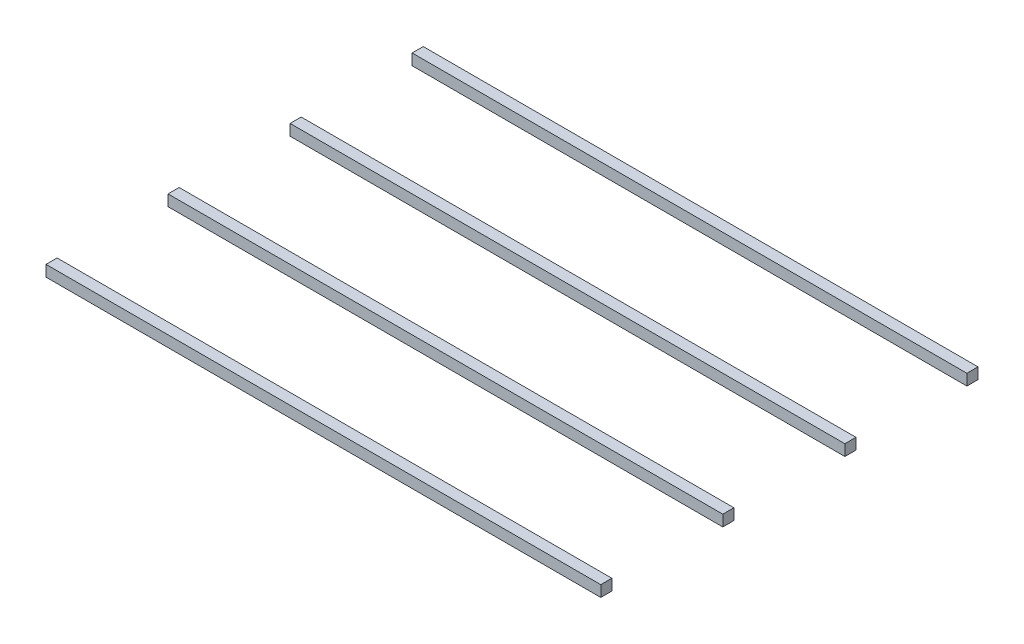
ISO-10303-21;
HEADER;
FILE_DESCRIPTION(('STEP AP214'),'2;1');
FILE_NAME('part.step','',(''),(''),'','','');
FILE_SCHEMA(('AUTOMOTIVE_DESIGN { 1 0 10303 214 1 1 1 1 }'));
ENDSEC;
DATA;
#1=APPLICATION_CONTEXT('core data for automotive mechanical design processes');
#2=APPLICATION_PROTOCOL_DEFINITION('international standard','automotive_design',2000,#1);
#3=PRODUCT_CONTEXT('',#1,'mechanical');
#4=PRODUCT('Part','Part','',(#3));
#5=PRODUCT_RELATED_PRODUCT_CATEGORY('part','',(#4));
#6=PRODUCT_DEFINITION_FORMATION('','',#4);
#7=PRODUCT_DEFINITION_CONTEXT('part definition',#1,'design');
#8=PRODUCT_DEFINITION('design','',#6,#7);
#9=PRODUCT_DEFINITION_SHAPE('','',#8);
#10=(LENGTH_UNIT() NAMED_UNIT(*) SI_UNIT(.MILLI.,.METRE.));
#11=(NAMED_UNIT(*) PLANE_ANGLE_UNIT() SI_UNIT($,.RADIAN.));
#12=(NAMED_UNIT(*) SI_UNIT($,.STERADIAN.) SOLID_ANGLE_UNIT());
#13=UNCERTAINTY_MEASURE_WITH_UNIT(LENGTH_MEASURE(1.E-05),#10,'distance_accuracy_value','');
#14=(GEOMETRIC_REPRESENTATION_CONTEXT(3) GLOBAL_UNCERTAINTY_ASSIGNED_CONTEXT((#13)) GLOBAL_UNIT_ASSIGNED_CONTEXT((#10,
#11,#12)) REPRESENTATION_CONTEXT('',''));
#15=CARTESIAN_POINT('',(0.,0.,0.));
#16=DIRECTION('',(0.,0.,1.));
#17=DIRECTION('',(1.,0.,0.));
#18=AXIS2_PLACEMENT_3D('',#15,#16,#17);
#19=CARTESIAN_POINT('',(-24.5316681534344,1.,26.5222632436078));
#20=DIRECTION('',(1.,0.,0.));
#21=DIRECTION('',(0.,0.,-1.));
#22=AXIS2_PLACEMENT_3D('',#19,#20,#21);
#23=PLANE('',#22);
#24=DIRECTION('',(0.,0.,1.));
#25=VECTOR('',#24,1.);
#26=CARTESIAN_POINT('',(-24.5316681534344,0.,26.5222632436078));
#27=LINE('',#26,#25);
#28=CARTESIAN_POINT('',(-24.5316681534344,0.,26.5222632436078));
#29=VERTEX_POINT('',#28);
#30=CARTESIAN_POINT('',(-24.5316681534344,0.,27.5222632436078));
#31=VERTEX_POINT('',#30);
#32=EDGE_CURVE('E107',#29,#31,#27,.T.);
#33=ORIENTED_EDGE('',*,*,#32,.T.);
#34=DIRECTION('',(0.,-1.,0.));
#35=VECTOR('',#34,1.);
#36=CARTESIAN_POINT('',(-24.5316681534344,1.,27.5222632436078));
#37=LINE('',#36,#35);
#38=CARTESIAN_POINT('',(-24.5316681534344,1.,27.5222632436078));
#39=VERTEX_POINT('',#38);
#40=EDGE_CURVE('E12',#39,#31,#37,.T.);
#41=ORIENTED_EDGE('',*,*,#40,.F.);
#42=DIRECTION('',(0.,0.,1.));
#43=VECTOR('',#42,1.);
#44=CARTESIAN_POINT('',(-24.5316681534344,1.,26.5222632436078));
#45=LINE('',#44,#43);
#46=CARTESIAN_POINT('',(-24.5316681534344,1.,26.5222632436078));
#47=VERTEX_POINT('',#46);
#48=EDGE_CURVE('E95',#47,#39,#45,.T.);
#49=ORIENTED_EDGE('',*,*,#48,.F.);
#50=DIRECTION('',(0.,-1.,0.));
#51=VECTOR('',#50,1.);
#52=CARTESIAN_POINT('',(-24.5316681534344,1.,26.5222632436078));
#53=LINE('',#52,#51);
#54=EDGE_CURVE('E103',#47,#29,#53,.T.);
#55=ORIENTED_EDGE('',*,*,#54,.T.);
#56=EDGE_LOOP('',(#33,#41,#49,#55));
#57=FACE_BOUND('',#56,.T.);
#58=ADVANCED_FACE('F44',(#57),#23,.F.);
#59=CARTESIAN_POINT('',(-24.5316681534344,1.,27.5222632436078));
#60=DIRECTION('',(0.,0.,-1.));
#61=DIRECTION('',(-1.,0.,0.));
#62=AXIS2_PLACEMENT_3D('',#59,#60,#61);
#63=PLANE('',#62);
#64=DIRECTION('',(1.,0.,0.));
#65=VECTOR('',#64,1.);
#66=CARTESIAN_POINT('',(-24.5316681534344,0.,27.5222632436078));
#67=LINE('',#66,#65);
#68=CARTESIAN_POINT('',(25.4683318465656,0.,27.5222632436078));
#69=VERTEX_POINT('',#68);
#70=EDGE_CURVE('E99',#31,#69,#67,.T.);
#71=ORIENTED_EDGE('',*,*,#70,.T.);
#72=DIRECTION('',(0.,-1.,0.));
#73=VECTOR('',#72,1.);
#74=CARTESIAN_POINT('',(25.4683318465656,1.,27.5222632436078));
#75=LINE('',#74,#73);
#76=CARTESIAN_POINT('',(25.4683318465656,1.,27.5222632436078));
#77=VERTEX_POINT('',#76);
#78=EDGE_CURVE('E52',#77,#69,#75,.T.);
#79=ORIENTED_EDGE('',*,*,#78,.F.);
#80=DIRECTION('',(1.,0.,0.));
#81=VECTOR('',#80,1.);
#82=CARTESIAN_POINT('',(-24.5316681534344,1.,27.5222632436078));
#83=LINE('',#82,#81);
#84=EDGE_CURVE('E90',#39,#77,#83,.T.);
#85=ORIENTED_EDGE('',*,*,#84,.F.);
#86=ORIENTED_EDGE('',*,*,#40,.T.);
#87=EDGE_LOOP('',(#71,#79,#85,#86));
#88=FACE_BOUND('',#87,.T.);
#89=ADVANCED_FACE('F98',(#88),#63,.F.);
#90=CARTESIAN_POINT('',(25.4683318465656,1.,26.5222632436078));
#91=DIRECTION('',(-1.,0.,0.));
#92=DIRECTION('',(0.,0.,1.));
#93=AXIS2_PLACEMENT_3D('',#90,#91,#92);
#94=PLANE('',#93);
#95=DIRECTION('',(0.,0.,-1.));
#96=VECTOR('',#95,1.);
#97=CARTESIAN_POINT('',(25.4683318465656,0.,26.5222632436078));
#98=LINE('',#97,#96);
#99=CARTESIAN_POINT('',(25.4683318465656,0.,26.5222632436078));
#100=VERTEX_POINT('',#99);
#101=EDGE_CURVE('E77',#69,#100,#98,.T.);
#102=ORIENTED_EDGE('',*,*,#101,.T.);
#103=DIRECTION('',(0.,-1.,0.));
#104=VECTOR('',#103,1.);
#105=CARTESIAN_POINT('',(25.4683318465656,1.,26.5222632436078));
#106=LINE('',#105,#104);
#107=CARTESIAN_POINT('',(25.4683318465656,1.,26.5222632436078));
#108=VERTEX_POINT('',#107);
#109=EDGE_CURVE('E100',#108,#100,#106,.T.);
#110=ORIENTED_EDGE('',*,*,#109,.F.);
#111=DIRECTION('',(0.,0.,-1.));
#112=VECTOR('',#111,1.);
#113=CARTESIAN_POINT('',(25.4683318465656,1.,26.5222632436078));
#114=LINE('',#113,#112);
#115=EDGE_CURVE('E93',#77,#108,#114,.T.);
#116=ORIENTED_EDGE('',*,*,#115,.F.);
#117=ORIENTED_EDGE('',*,*,#78,.T.);
#118=EDGE_LOOP('',(#102,#110,#116,#117));
#119=FACE_BOUND('',#118,.T.);
#120=ADVANCED_FACE('F101',(#119),#94,.F.);
#121=CARTESIAN_POINT('',(-24.5316681534344,1.,26.5222632436078));
#122=DIRECTION('',(0.,0.,1.));
#123=DIRECTION('',(1.,0.,0.));
#124=AXIS2_PLACEMENT_3D('',#121,#122,#123);
#125=PLANE('',#124);
#126=DIRECTION('',(-1.,0.,0.));
#127=VECTOR('',#126,1.);
#128=CARTESIAN_POINT('',(-24.5316681534344,0.,26.5222632436078));
#129=LINE('',#128,#127);
#130=EDGE_CURVE('E83',#100,#29,#129,.T.);
#131=ORIENTED_EDGE('',*,*,#130,.T.);
#132=ORIENTED_EDGE('',*,*,#54,.F.);
#133=DIRECTION('',(-1.,0.,0.));
#134=VECTOR('',#133,1.);
#135=CARTESIAN_POINT('',(-24.5316681534344,1.,26.5222632436078));
#136=LINE('',#135,#134);
#137=EDGE_CURVE('E60',#108,#47,#136,.T.);
#138=ORIENTED_EDGE('',*,*,#137,.F.);
#139=ORIENTED_EDGE('',*,*,#109,.T.);
#140=EDGE_LOOP('',(#131,#132,#138,#139));
#141=FACE_BOUND('',#140,.T.);
#142=ADVANCED_FACE('F114',(#141),#125,.F.);
#143=CARTESIAN_POINT('',(0.,1.,0.));
#144=DIRECTION('',(0.,1.,0.));
#145=DIRECTION('',(0.,0.,1.));
#146=AXIS2_PLACEMENT_3D('',#143,#144,#145);
#147=PLANE('',#146);
#148=ORIENTED_EDGE('',*,*,#48,.T.);
#149=ORIENTED_EDGE('',*,*,#84,.T.);
#150=ORIENTED_EDGE('',*,*,#115,.T.);
#151=ORIENTED_EDGE('',*,*,#137,.T.);
#152=EDGE_LOOP('',(#148,#149,#150,#151));
#153=FACE_BOUND('',#152,.T.);
#154=ADVANCED_FACE('F91',(#153),#147,.T.);
#155=CARTESIAN_POINT('',(0.,0.,0.));
#156=DIRECTION('',(0.,1.,0.));
#157=DIRECTION('',(0.,0.,1.));
#158=AXIS2_PLACEMENT_3D('',#155,#156,#157);
#159=PLANE('',#158);
#160=ORIENTED_EDGE('',*,*,#32,.F.);
#161=ORIENTED_EDGE('',*,*,#130,.F.);
#162=ORIENTED_EDGE('',*,*,#101,.F.);
#163=ORIENTED_EDGE('',*,*,#70,.F.);
#164=EDGE_LOOP('',(#160,#161,#162,#163));
#165=FACE_BOUND('',#164,.T.);
#166=ADVANCED_FACE('F117',(#165),#159,.F.);
#167=CLOSED_SHELL('',(#58,#89,#120,#142,#154,#166));
#168=MANIFOLD_SOLID_BREP('B2',#167);
#169=CARTESIAN_POINT('',(-24.5316681534344,1.,15.5222632436078));
#170=DIRECTION('',(1.,0.,0.));
#171=DIRECTION('',(0.,0.,-1.));
#172=AXIS2_PLACEMENT_3D('',#169,#170,#171);
#173=PLANE('',#172);
#174=DIRECTION('',(0.,0.,1.));
#175=VECTOR('',#174,1.);
#176=CARTESIAN_POINT('',(-24.5316681534344,0.,15.5222632436078));
#177=LINE('',#176,#175);
#178=CARTESIAN_POINT('',(-24.5316681534344,0.,15.5222632436078));
#179=VERTEX_POINT('',#178);
#180=CARTESIAN_POINT('',(-24.5316681534344,0.,16.5222632436078));
#181=VERTEX_POINT('',#180);
#182=EDGE_CURVE('E241',#179,#181,#177,.T.);
#183=ORIENTED_EDGE('',*,*,#182,.T.);
#184=DIRECTION('',(0.,-1.,0.));
#185=VECTOR('',#184,1.);
#186=CARTESIAN_POINT('',(-24.5316681534344,1.,16.5222632436078));
#187=LINE('',#186,#185);
#188=CARTESIAN_POINT('',(-24.5316681534344,1.,16.5222632436078));
#189=VERTEX_POINT('',#188);
#190=EDGE_CURVE('E42',#189,#181,#187,.T.);
#191=ORIENTED_EDGE('',*,*,#190,.F.);
#192=DIRECTION('',(0.,0.,1.));
#193=VECTOR('',#192,1.);
#194=CARTESIAN_POINT('',(-24.5316681534344,1.,15.5222632436078));
#195=LINE('',#194,#193);
#196=CARTESIAN_POINT('',(-24.5316681534344,1.,15.5222632436078));
#197=VERTEX_POINT('',#196);
#198=EDGE_CURVE('E229',#197,#189,#195,.T.);
#199=ORIENTED_EDGE('',*,*,#198,.F.);
#200=DIRECTION('',(0.,-1.,0.));
#201=VECTOR('',#200,1.);
#202=CARTESIAN_POINT('',(-24.5316681534344,1.,15.5222632436078));
#203=LINE('',#202,#201);
#204=EDGE_CURVE('E237',#197,#179,#203,.T.);
#205=ORIENTED_EDGE('',*,*,#204,.T.);
#206=EDGE_LOOP('',(#183,#191,#199,#205));
#207=FACE_BOUND('',#206,.T.);
#208=ADVANCED_FACE('F178',(#207),#173,.F.);
#209=CARTESIAN_POINT('',(-24.5316681534344,1.,16.5222632436078));
#210=DIRECTION('',(0.,0.,-1.));
#211=DIRECTION('',(-1.,0.,0.));
#212=AXIS2_PLACEMENT_3D('',#209,#210,#211);
#213=PLANE('',#212);
#214=DIRECTION('',(1.,0.,0.));
#215=VECTOR('',#214,1.);
#216=CARTESIAN_POINT('',(-24.5316681534344,0.,16.5222632436078));
#217=LINE('',#216,#215);
#218=CARTESIAN_POINT('',(25.4683318465656,0.,16.5222632436078));
#219=VERTEX_POINT('',#218);
#220=EDGE_CURVE('E233',#181,#219,#217,.T.);
#221=ORIENTED_EDGE('',*,*,#220,.T.);
#222=DIRECTION('',(0.,-1.,0.));
#223=VECTOR('',#222,1.);
#224=CARTESIAN_POINT('',(25.4683318465656,1.,16.5222632436078));
#225=LINE('',#224,#223);
#226=CARTESIAN_POINT('',(25.4683318465656,1.,16.5222632436078));
#227=VERTEX_POINT('',#226);
#228=EDGE_CURVE('E186',#227,#219,#225,.T.);
#229=ORIENTED_EDGE('',*,*,#228,.F.);
#230=DIRECTION('',(1.,0.,0.));
#231=VECTOR('',#230,1.);
#232=CARTESIAN_POINT('',(-24.5316681534344,1.,16.5222632436078));
#233=LINE('',#232,#231);
#234=EDGE_CURVE('E224',#189,#227,#233,.T.);
#235=ORIENTED_EDGE('',*,*,#234,.F.);
#236=ORIENTED_EDGE('',*,*,#190,.T.);
#237=EDGE_LOOP('',(#221,#229,#235,#236));
#238=FACE_BOUND('',#237,.T.);
#239=ADVANCED_FACE('F232',(#238),#213,.F.);
#240=CARTESIAN_POINT('',(25.4683318465656,1.,15.5222632436078));
#241=DIRECTION('',(-1.,0.,0.));
#242=DIRECTION('',(0.,0.,1.));
#243=AXIS2_PLACEMENT_3D('',#240,#241,#242);
#244=PLANE('',#243);
#245=DIRECTION('',(0.,0.,-1.));
#246=VECTOR('',#245,1.);
#247=CARTESIAN_POINT('',(25.4683318465656,0.,15.5222632436078));
#248=LINE('',#247,#246);
#249=CARTESIAN_POINT('',(25.4683318465656,0.,15.5222632436078));
#250=VERTEX_POINT('',#249);
#251=EDGE_CURVE('E211',#219,#250,#248,.T.);
#252=ORIENTED_EDGE('',*,*,#251,.T.);
#253=DIRECTION('',(0.,-1.,0.));
#254=VECTOR('',#253,1.);
#255=CARTESIAN_POINT('',(25.4683318465656,1.,15.5222632436078));
#256=LINE('',#255,#254);
#257=CARTESIAN_POINT('',(25.4683318465656,1.,15.5222632436078));
#258=VERTEX_POINT('',#257);
#259=EDGE_CURVE('E234',#258,#250,#256,.T.);
#260=ORIENTED_EDGE('',*,*,#259,.F.);
#261=DIRECTION('',(0.,0.,-1.));
#262=VECTOR('',#261,1.);
#263=CARTESIAN_POINT('',(25.4683318465656,1.,15.5222632436078));
#264=LINE('',#263,#262);
#265=EDGE_CURVE('E227',#227,#258,#264,.T.);
#266=ORIENTED_EDGE('',*,*,#265,.F.);
#267=ORIENTED_EDGE('',*,*,#228,.T.);
#268=EDGE_LOOP('',(#252,#260,#266,#267));
#269=FACE_BOUND('',#268,.T.);
#270=ADVANCED_FACE('F235',(#269),#244,.F.);
#271=CARTESIAN_POINT('',(-24.5316681534344,1.,15.5222632436078));
#272=DIRECTION('',(0.,0.,1.));
#273=DIRECTION('',(1.,0.,0.));
#274=AXIS2_PLACEMENT_3D('',#271,#272,#273);
#275=PLANE('',#274);
#276=DIRECTION('',(-1.,0.,0.));
#277=VECTOR('',#276,1.);
#278=CARTESIAN_POINT('',(-24.5316681534344,0.,15.5222632436078));
#279=LINE('',#278,#277);
#280=EDGE_CURVE('E217',#250,#179,#279,.T.);
#281=ORIENTED_EDGE('',*,*,#280,.T.);
#282=ORIENTED_EDGE('',*,*,#204,.F.);
#283=DIRECTION('',(-1.,0.,0.));
#284=VECTOR('',#283,1.);
#285=CARTESIAN_POINT('',(-24.5316681534344,1.,15.5222632436078));
#286=LINE('',#285,#284);
#287=EDGE_CURVE('E194',#258,#197,#286,.T.);
#288=ORIENTED_EDGE('',*,*,#287,.F.);
#289=ORIENTED_EDGE('',*,*,#259,.T.);
#290=EDGE_LOOP('',(#281,#282,#288,#289));
#291=FACE_BOUND('',#290,.T.);
#292=ADVANCED_FACE('F248',(#291),#275,.F.);
#293=CARTESIAN_POINT('',(0.,1.,0.));
#294=DIRECTION('',(0.,1.,0.));
#295=DIRECTION('',(0.,0.,1.));
#296=AXIS2_PLACEMENT_3D('',#293,#294,#295);
#297=PLANE('',#296);
#298=ORIENTED_EDGE('',*,*,#198,.T.);
#299=ORIENTED_EDGE('',*,*,#234,.T.);
#300=ORIENTED_EDGE('',*,*,#265,.T.);
#301=ORIENTED_EDGE('',*,*,#287,.T.);
#302=EDGE_LOOP('',(#298,#299,#300,#301));
#303=FACE_BOUND('',#302,.T.);
#304=ADVANCED_FACE('F225',(#303),#297,.T.);
#305=CARTESIAN_POINT('',(0.,0.,0.));
#306=DIRECTION('',(0.,1.,0.));
#307=DIRECTION('',(0.,0.,1.));
#308=AXIS2_PLACEMENT_3D('',#305,#306,#307);
#309=PLANE('',#308);
#310=ORIENTED_EDGE('',*,*,#182,.F.);
#311=ORIENTED_EDGE('',*,*,#280,.F.);
#312=ORIENTED_EDGE('',*,*,#251,.F.);
#313=ORIENTED_EDGE('',*,*,#220,.F.);
#314=EDGE_LOOP('',(#310,#311,#312,#313));
#315=FACE_BOUND('',#314,.T.);
#316=ADVANCED_FACE('F251',(#315),#309,.F.);
#317=CLOSED_SHELL('',(#208,#239,#270,#292,#304,#316));
#318=MANIFOLD_SOLID_BREP('B6',#317);
#319=CARTESIAN_POINT('',(-24.5316681534344,1.,4.52226324360778));
#320=DIRECTION('',(1.,0.,0.));
#321=DIRECTION('',(0.,0.,-1.));
#322=AXIS2_PLACEMENT_3D('',#319,#320,#321);
#323=PLANE('',#322);
#324=DIRECTION('',(0.,0.,1.));
#325=VECTOR('',#324,1.);
#326=CARTESIAN_POINT('',(-24.5316681534344,0.,4.52226324360778));
#327=LINE('',#326,#325);
#328=CARTESIAN_POINT('',(-24.5316681534344,0.,4.52226324360778));
#329=VERTEX_POINT('',#328);
#330=CARTESIAN_POINT('',(-24.5316681534344,0.,5.52226324360778));
#331=VERTEX_POINT('',#330);
#332=EDGE_CURVE('E374',#329,#331,#327,.T.);
#333=ORIENTED_EDGE('',*,*,#332,.T.);
#334=DIRECTION('',(0.,-1.,0.));
#335=VECTOR('',#334,1.);
#336=CARTESIAN_POINT('',(-24.5316681534344,1.,5.52226324360778));
#337=LINE('',#336,#335);
#338=CARTESIAN_POINT('',(-24.5316681534344,1.,5.52226324360778));
#339=VERTEX_POINT('',#338);
#340=EDGE_CURVE('E176',#339,#331,#337,.T.);
#341=ORIENTED_EDGE('',*,*,#340,.F.);
#342=DIRECTION('',(0.,0.,1.));
#343=VECTOR('',#342,1.);
#344=CARTESIAN_POINT('',(-24.5316681534344,1.,4.52226324360778));
#345=LINE('',#344,#343);
#346=CARTESIAN_POINT('',(-24.5316681534344,1.,4.52226324360778));
#347=VERTEX_POINT('',#346);
#348=EDGE_CURVE('E362',#347,#339,#345,.T.);
#349=ORIENTED_EDGE('',*,*,#348,.F.);
#350=DIRECTION('',(0.,-1.,0.));
#351=VECTOR('',#350,1.);
#352=CARTESIAN_POINT('',(-24.5316681534344,1.,4.52226324360778));
#353=LINE('',#352,#351);
#354=EDGE_CURVE('E370',#347,#329,#353,.T.);
#355=ORIENTED_EDGE('',*,*,#354,.T.);
#356=EDGE_LOOP('',(#333,#341,#349,#355));
#357=FACE_BOUND('',#356,.T.);
#358=ADVANCED_FACE('F311',(#357),#323,.F.);
#359=CARTESIAN_POINT('',(-24.5316681534344,1.,5.52226324360778));
#360=DIRECTION('',(0.,0.,-1.));
#361=DIRECTION('',(-1.,0.,0.));
#362=AXIS2_PLACEMENT_3D('',#359,#360,#361);
#363=PLANE('',#362);
#364=DIRECTION('',(1.,0.,0.));
#365=VECTOR('',#364,1.);
#366=CARTESIAN_POINT('',(-24.5316681534344,0.,5.52226324360778));
#367=LINE('',#366,#365);
#368=CARTESIAN_POINT('',(25.4683318465656,0.,5.52226324360778));
#369=VERTEX_POINT('',#368);
#370=EDGE_CURVE('E366',#331,#369,#367,.T.);
#371=ORIENTED_EDGE('',*,*,#370,.T.);
#372=DIRECTION('',(0.,-1.,0.));
#373=VECTOR('',#372,1.);
#374=CARTESIAN_POINT('',(25.4683318465656,1.,5.52226324360778));
#375=LINE('',#374,#373);
#376=CARTESIAN_POINT('',(25.4683318465656,1.,5.52226324360778));
#377=VERTEX_POINT('',#376);
#378=EDGE_CURVE('E319',#377,#369,#375,.T.);
#379=ORIENTED_EDGE('',*,*,#378,.F.);
#380=DIRECTION('',(1.,0.,0.));
#381=VECTOR('',#380,1.);
#382=CARTESIAN_POINT('',(-24.5316681534344,1.,5.52226324360778));
#383=LINE('',#382,#381);
#384=EDGE_CURVE('E357',#339,#377,#383,.T.);
#385=ORIENTED_EDGE('',*,*,#384,.F.);
#386=ORIENTED_EDGE('',*,*,#340,.T.);
#387=EDGE_LOOP('',(#371,#379,#385,#386));
#388=FACE_BOUND('',#387,.T.);
#389=ADVANCED_FACE('F365',(#388),#363,.F.);
#390=CARTESIAN_POINT('',(25.4683318465656,1.,4.52226324360778));
#391=DIRECTION('',(-1.,0.,0.));
#392=DIRECTION('',(0.,0.,1.));
#393=AXIS2_PLACEMENT_3D('',#390,#391,#392);
#394=PLANE('',#393);
#395=DIRECTION('',(0.,0.,-1.));
#396=VECTOR('',#395,1.);
#397=CARTESIAN_POINT('',(25.4683318465656,0.,4.52226324360778));
#398=LINE('',#397,#396);
#399=CARTESIAN_POINT('',(25.4683318465656,0.,4.52226324360778));
#400=VERTEX_POINT('',#399);
#401=EDGE_CURVE('E344',#369,#400,#398,.T.);
#402=ORIENTED_EDGE('',*,*,#401,.T.);
#403=DIRECTION('',(0.,-1.,0.));
#404=VECTOR('',#403,1.);
#405=CARTESIAN_POINT('',(25.4683318465656,1.,4.52226324360778));
#406=LINE('',#405,#404);
#407=CARTESIAN_POINT('',(25.4683318465656,1.,4.52226324360778));
#408=VERTEX_POINT('',#407);
#409=EDGE_CURVE('E367',#408,#400,#406,.T.);
#410=ORIENTED_EDGE('',*,*,#409,.F.);
#411=DIRECTION('',(0.,0.,-1.));
#412=VECTOR('',#411,1.);
#413=CARTESIAN_POINT('',(25.4683318465656,1.,4.52226324360778));
#414=LINE('',#413,#412);
#415=EDGE_CURVE('E360',#377,#408,#414,.T.);
#416=ORIENTED_EDGE('',*,*,#415,.F.);
#417=ORIENTED_EDGE('',*,*,#378,.T.);
#418=EDGE_LOOP('',(#402,#410,#416,#417));
#419=FACE_BOUND('',#418,.T.);
#420=ADVANCED_FACE('F368',(#419),#394,.F.);
#421=CARTESIAN_POINT('',(-24.5316681534344,1.,4.52226324360778));
#422=DIRECTION('',(0.,0.,1.));
#423=DIRECTION('',(1.,0.,0.));
#424=AXIS2_PLACEMENT_3D('',#421,#422,#423);
#425=PLANE('',#424);
#426=DIRECTION('',(-1.,0.,0.));
#427=VECTOR('',#426,1.);
#428=CARTESIAN_POINT('',(-24.5316681534344,0.,4.52226324360778));
#429=LINE('',#428,#427);
#430=EDGE_CURVE('E350',#400,#329,#429,.T.);
#431=ORIENTED_EDGE('',*,*,#430,.T.);
#432=ORIENTED_EDGE('',*,*,#354,.F.);
#433=DIRECTION('',(-1.,0.,0.));
#434=VECTOR('',#433,1.);
#435=CARTESIAN_POINT('',(-24.5316681534344,1.,4.52226324360778));
#436=LINE('',#435,#434);
#437=EDGE_CURVE('E327',#408,#347,#436,.T.);
#438=ORIENTED_EDGE('',*,*,#437,.F.);
#439=ORIENTED_EDGE('',*,*,#409,.T.);
#440=EDGE_LOOP('',(#431,#432,#438,#439));
#441=FACE_BOUND('',#440,.T.);
#442=ADVANCED_FACE('F381',(#441),#425,.F.);
#443=CARTESIAN_POINT('',(0.,1.,0.));
#444=DIRECTION('',(0.,1.,0.));
#445=DIRECTION('',(0.,0.,1.));
#446=AXIS2_PLACEMENT_3D('',#443,#444,#445);
#447=PLANE('',#446);
#448=ORIENTED_EDGE('',*,*,#348,.T.);
#449=ORIENTED_EDGE('',*,*,#384,.T.);
#450=ORIENTED_EDGE('',*,*,#415,.T.);
#451=ORIENTED_EDGE('',*,*,#437,.T.);
#452=EDGE_LOOP('',(#448,#449,#450,#451));
#453=FACE_BOUND('',#452,.T.);
#454=ADVANCED_FACE('F358',(#453),#447,.T.);
#455=CARTESIAN_POINT('',(0.,0.,0.));
#456=DIRECTION('',(0.,1.,0.));
#457=DIRECTION('',(0.,0.,1.));
#458=AXIS2_PLACEMENT_3D('',#455,#456,#457);
#459=PLANE('',#458);
#460=ORIENTED_EDGE('',*,*,#332,.F.);
#461=ORIENTED_EDGE('',*,*,#430,.F.);
#462=ORIENTED_EDGE('',*,*,#401,.F.);
#463=ORIENTED_EDGE('',*,*,#370,.F.);
#464=EDGE_LOOP('',(#460,#461,#462,#463));
#465=FACE_BOUND('',#464,.T.);
#466=ADVANCED_FACE('F384',(#465),#459,.F.);
#467=CLOSED_SHELL('',(#358,#389,#420,#442,#454,#466));
#468=MANIFOLD_SOLID_BREP('B36',#467);
#469=CARTESIAN_POINT('',(-24.5316681534344,1.,-6.47773675639222));
#470=DIRECTION('',(1.,0.,0.));
#471=DIRECTION('',(0.,0.,-1.));
#472=AXIS2_PLACEMENT_3D('',#469,#470,#471);
#473=PLANE('',#472);
#474=DIRECTION('',(0.,0.,1.));
#475=VECTOR('',#474,1.);
#476=CARTESIAN_POINT('',(-24.5316681534344,0.,-6.47773675639222));
#477=LINE('',#476,#475);
#478=CARTESIAN_POINT('',(-24.5316681534344,0.,-6.47773675639222));
#479=VERTEX_POINT('',#478);
#480=CARTESIAN_POINT('',(-24.5316681534344,0.,-5.47773675639222));
#481=VERTEX_POINT('',#480);
#482=EDGE_CURVE('E498',#479,#481,#477,.T.);
#483=ORIENTED_EDGE('',*,*,#482,.T.);
#484=DIRECTION('',(0.,-1.,0.));
#485=VECTOR('',#484,1.);
#486=CARTESIAN_POINT('',(-24.5316681534344,1.,-5.47773675639222));
#487=LINE('',#486,#485);
#488=CARTESIAN_POINT('',(-24.5316681534344,1.,-5.47773675639222));
#489=VERTEX_POINT('',#488);
#490=EDGE_CURVE('E309',#489,#481,#487,.T.);
#491=ORIENTED_EDGE('',*,*,#490,.F.);
#492=DIRECTION('',(0.,0.,1.));
#493=VECTOR('',#492,1.);
#494=CARTESIAN_POINT('',(-24.5316681534344,1.,-6.47773675639222));
#495=LINE('',#494,#493);
#496=CARTESIAN_POINT('',(-24.5316681534344,1.,-6.47773675639222));
#497=VERTEX_POINT('',#496);
#498=EDGE_CURVE('E486',#497,#489,#495,.T.);
#499=ORIENTED_EDGE('',*,*,#498,.F.);
#500=DIRECTION('',(0.,-1.,0.));
#501=VECTOR('',#500,1.);
#502=CARTESIAN_POINT('',(-24.5316681534344,1.,-6.47773675639222));
#503=LINE('',#502,#501);
#504=EDGE_CURVE('E494',#497,#479,#503,.T.);
#505=ORIENTED_EDGE('',*,*,#504,.T.);
#506=EDGE_LOOP('',(#483,#491,#499,#505));
#507=FACE_BOUND('',#506,.T.);
#508=ADVANCED_FACE('F435',(#507),#473,.F.);
#509=CARTESIAN_POINT('',(-24.5316681534344,1.,-5.47773675639222));
#510=DIRECTION('',(0.,0.,-1.));
#511=DIRECTION('',(-1.,0.,0.));
#512=AXIS2_PLACEMENT_3D('',#509,#510,#511);
#513=PLANE('',#512);
#514=DIRECTION('',(1.,0.,0.));
#515=VECTOR('',#514,1.);
#516=CARTESIAN_POINT('',(-24.5316681534344,0.,-5.47773675639222));
#517=LINE('',#516,#515);
#518=CARTESIAN_POINT('',(25.4683318465656,0.,-5.47773675639222));
#519=VERTEX_POINT('',#518);
#520=EDGE_CURVE('E490',#481,#519,#517,.T.);
#521=ORIENTED_EDGE('',*,*,#520,.T.);
#522=DIRECTION('',(0.,-1.,0.));
#523=VECTOR('',#522,1.);
#524=CARTESIAN_POINT('',(25.4683318465656,1.,-5.47773675639222));
#525=LINE('',#524,#523);
#526=CARTESIAN_POINT('',(25.4683318465656,1.,-5.47773675639222));
#527=VERTEX_POINT('',#526);
#528=EDGE_CURVE('E443',#527,#519,#525,.T.);
#529=ORIENTED_EDGE('',*,*,#528,.F.);
#530=DIRECTION('',(1.,0.,0.));
#531=VECTOR('',#530,1.);
#532=CARTESIAN_POINT('',(-24.5316681534344,1.,-5.47773675639222));
#533=LINE('',#532,#531);
#534=EDGE_CURVE('E481',#489,#527,#533,.T.);
#535=ORIENTED_EDGE('',*,*,#534,.F.);
#536=ORIENTED_EDGE('',*,*,#490,.T.);
#537=EDGE_LOOP('',(#521,#529,#535,#536));
#538=FACE_BOUND('',#537,.T.);
#539=ADVANCED_FACE('F489',(#538),#513,.F.);
#540=CARTESIAN_POINT('',(25.4683318465656,1.,-6.47773675639222));
#541=DIRECTION('',(-1.,0.,0.));
#542=DIRECTION('',(0.,0.,1.));
#543=AXIS2_PLACEMENT_3D('',#540,#541,#542);
#544=PLANE('',#543);
#545=DIRECTION('',(0.,0.,-1.));
#546=VECTOR('',#545,1.);
#547=CARTESIAN_POINT('',(25.4683318465656,0.,-6.47773675639222));
#548=LINE('',#547,#546);
#549=CARTESIAN_POINT('',(25.4683318465656,0.,-6.47773675639222));
#550=VERTEX_POINT('',#549);
#551=EDGE_CURVE('E468',#519,#550,#548,.T.);
#552=ORIENTED_EDGE('',*,*,#551,.T.);
#553=DIRECTION('',(0.,-1.,0.));
#554=VECTOR('',#553,1.);
#555=CARTESIAN_POINT('',(25.4683318465656,1.,-6.47773675639222));
#556=LINE('',#555,#554);
#557=CARTESIAN_POINT('',(25.4683318465656,1.,-6.47773675639222));
#558=VERTEX_POINT('',#557);
#559=EDGE_CURVE('E491',#558,#550,#556,.T.);
#560=ORIENTED_EDGE('',*,*,#559,.F.);
#561=DIRECTION('',(0.,0.,-1.));
#562=VECTOR('',#561,1.);
#563=CARTESIAN_POINT('',(25.4683318465656,1.,-6.47773675639222));
#564=LINE('',#563,#562);
#565=EDGE_CURVE('E484',#527,#558,#564,.T.);
#566=ORIENTED_EDGE('',*,*,#565,.F.);
#567=ORIENTED_EDGE('',*,*,#528,.T.);
#568=EDGE_LOOP('',(#552,#560,#566,#567));
#569=FACE_BOUND('',#568,.T.);
#570=ADVANCED_FACE('F492',(#569),#544,.F.);
#571=CARTESIAN_POINT('',(-24.5316681534344,1.,-6.47773675639222));
#572=DIRECTION('',(0.,0.,1.));
#573=DIRECTION('',(1.,0.,0.));
#574=AXIS2_PLACEMENT_3D('',#571,#572,#573);
#575=PLANE('',#574);
#576=DIRECTION('',(-1.,0.,0.));
#577=VECTOR('',#576,1.);
#578=CARTESIAN_POINT('',(-24.5316681534344,0.,-6.47773675639222));
#579=LINE('',#578,#577);
#580=EDGE_CURVE('E474',#550,#479,#579,.T.);
#581=ORIENTED_EDGE('',*,*,#580,.T.);
#582=ORIENTED_EDGE('',*,*,#504,.F.);
#583=DIRECTION('',(-1.,0.,0.));
#584=VECTOR('',#583,1.);
#585=CARTESIAN_POINT('',(-24.5316681534344,1.,-6.47773675639222));
#586=LINE('',#585,#584);
#587=EDGE_CURVE('E451',#558,#497,#586,.T.);
#588=ORIENTED_EDGE('',*,*,#587,.F.);
#589=ORIENTED_EDGE('',*,*,#559,.T.);
#590=EDGE_LOOP('',(#581,#582,#588,#589));
#591=FACE_BOUND('',#590,.T.);
#592=ADVANCED_FACE('F505',(#591),#575,.F.);
#593=CARTESIAN_POINT('',(0.,1.,0.));
#594=DIRECTION('',(0.,1.,0.));
#595=DIRECTION('',(0.,0.,1.));
#596=AXIS2_PLACEMENT_3D('',#593,#594,#595);
#597=PLANE('',#596);
#598=ORIENTED_EDGE('',*,*,#498,.T.);
#599=ORIENTED_EDGE('',*,*,#534,.T.);
#600=ORIENTED_EDGE('',*,*,#565,.T.);
#601=ORIENTED_EDGE('',*,*,#587,.T.);
#602=EDGE_LOOP('',(#598,#599,#600,#601));
#603=FACE_BOUND('',#602,.T.);
#604=ADVANCED_FACE('F482',(#603),#597,.T.);
#605=CARTESIAN_POINT('',(0.,0.,0.));
#606=DIRECTION('',(0.,1.,0.));
#607=DIRECTION('',(0.,0.,1.));
#608=AXIS2_PLACEMENT_3D('',#605,#606,#607);
#609=PLANE('',#608);
#610=ORIENTED_EDGE('',*,*,#482,.F.);
#611=ORIENTED_EDGE('',*,*,#580,.F.);
#612=ORIENTED_EDGE('',*,*,#551,.F.);
#613=ORIENTED_EDGE('',*,*,#520,.F.);
#614=EDGE_LOOP('',(#610,#611,#612,#613));
#615=FACE_BOUND('',#614,.T.);
#616=ADVANCED_FACE('F508',(#615),#609,.F.);
#617=CLOSED_SHELL('',(#508,#539,#570,#592,#604,#616));
#618=MANIFOLD_SOLID_BREP('B170',#617);
#619=ADVANCED_BREP_SHAPE_REPRESENTATION('',(#18,#168,#318,#468,#618),#14);
#620=SHAPE_DEFINITION_REPRESENTATION(#9,#619);
ENDSEC;
END-ISO-10303-21;
